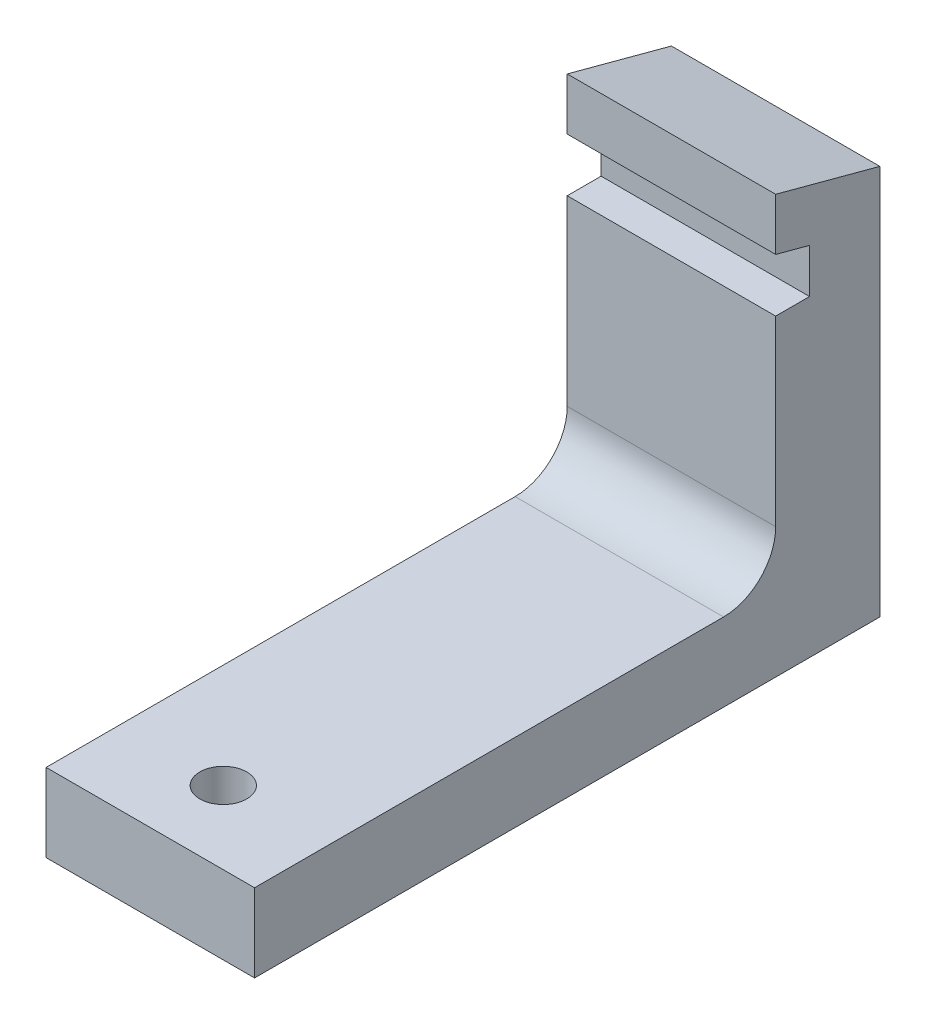
ISO-10303-21;
HEADER;
FILE_DESCRIPTION(('STEP AP214'),'2;1');
FILE_NAME('part.step','',(''),(''),'','','');
FILE_SCHEMA(('AUTOMOTIVE_DESIGN { 1 0 10303 214 1 1 1 1 }'));
ENDSEC;
DATA;
#1=APPLICATION_CONTEXT('core data for automotive mechanical design processes');
#2=APPLICATION_PROTOCOL_DEFINITION('international standard','automotive_design',2000,#1);
#3=PRODUCT_CONTEXT('',#1,'mechanical');
#4=PRODUCT('Part','Part','',(#3));
#5=PRODUCT_RELATED_PRODUCT_CATEGORY('part','',(#4));
#6=PRODUCT_DEFINITION_FORMATION('','',#4);
#7=PRODUCT_DEFINITION_CONTEXT('part definition',#1,'design');
#8=PRODUCT_DEFINITION('design','',#6,#7);
#9=PRODUCT_DEFINITION_SHAPE('','',#8);
#10=(LENGTH_UNIT() NAMED_UNIT(*) SI_UNIT(.MILLI.,.METRE.));
#11=(NAMED_UNIT(*) PLANE_ANGLE_UNIT() SI_UNIT($,.RADIAN.));
#12=(NAMED_UNIT(*) SI_UNIT($,.STERADIAN.) SOLID_ANGLE_UNIT());
#13=UNCERTAINTY_MEASURE_WITH_UNIT(LENGTH_MEASURE(1.E-05),#10,'distance_accuracy_value','');
#14=(GEOMETRIC_REPRESENTATION_CONTEXT(3) GLOBAL_UNCERTAINTY_ASSIGNED_CONTEXT((#13)) GLOBAL_UNIT_ASSIGNED_CONTEXT((#10,
#11,#12)) REPRESENTATION_CONTEXT('',''));
#15=CARTESIAN_POINT('',(0.,0.,0.));
#16=DIRECTION('',(0.,0.,1.));
#17=DIRECTION('',(1.,0.,0.));
#18=AXIS2_PLACEMENT_3D('',#15,#16,#17);
#19=CARTESIAN_POINT('',(4.,3.,0.));
#20=DIRECTION('',(0.,0.,-1.));
#21=DIRECTION('',(0.,1.,0.));
#22=AXIS2_PLACEMENT_3D('',#19,#20,#21);
#23=PLANE('',#22);
#24=DIRECTION('',(0.,-1.,0.));
#25=VECTOR('',#24,1.);
#26=CARTESIAN_POINT('',(-4.,3.,0.));
#27=LINE('',#26,#25);
#28=CARTESIAN_POINT('',(-4.,3.,0.));
#29=VERTEX_POINT('',#28);
#30=CARTESIAN_POINT('',(-4.,0.,0.));
#31=VERTEX_POINT('',#30);
#32=EDGE_CURVE('E143',#29,#31,#27,.T.);
#33=ORIENTED_EDGE('',*,*,#32,.T.);
#34=DIRECTION('',(-1.,0.,0.));
#35=VECTOR('',#34,1.);
#36=CARTESIAN_POINT('',(4.,0.,0.));
#37=LINE('',#36,#35);
#38=CARTESIAN_POINT('',(4.,0.,0.));
#39=VERTEX_POINT('',#38);
#40=EDGE_CURVE('E124',#39,#31,#37,.T.);
#41=ORIENTED_EDGE('',*,*,#40,.F.);
#42=DIRECTION('',(0.,-1.,0.));
#43=VECTOR('',#42,1.);
#44=CARTESIAN_POINT('',(4.,3.,0.));
#45=LINE('',#44,#43);
#46=CARTESIAN_POINT('',(4.,3.,0.));
#47=VERTEX_POINT('',#46);
#48=EDGE_CURVE('E131',#47,#39,#45,.T.);
#49=ORIENTED_EDGE('',*,*,#48,.F.);
#50=DIRECTION('',(-1.,0.,0.));
#51=VECTOR('',#50,1.);
#52=CARTESIAN_POINT('',(4.,3.,0.));
#53=LINE('',#52,#51);
#54=EDGE_CURVE('E170',#47,#29,#53,.T.);
#55=ORIENTED_EDGE('',*,*,#54,.T.);
#56=EDGE_LOOP('',(#33,#41,#49,#55));
#57=FACE_BOUND('',#56,.T.);
#58=ADVANCED_FACE('F36',(#57),#23,.F.);
#59=CARTESIAN_POINT('',(4.,0.,0.));
#60=DIRECTION('',(0.,1.,0.));
#61=DIRECTION('',(0.,0.,1.));
#62=AXIS2_PLACEMENT_3D('',#59,#60,#61);
#63=PLANE('',#62);
#64=CARTESIAN_POINT('',(0.,0.,-20.8));
#65=DIRECTION('',(0.,-1.,0.));
#66=DIRECTION('',(0.,0.,-1.));
#67=AXIS2_PLACEMENT_3D('',#64,#65,#66);
#68=CIRCLE('',#67,0.9);
#69=CARTESIAN_POINT('',(0.,0.,-21.7));
#70=VERTEX_POINT('',#69);
#71=EDGE_CURVE('E207',#70,#70,#68,.T.);
#72=ORIENTED_EDGE('',*,*,#71,.F.);
#73=EDGE_LOOP('',(#72));
#74=FACE_BOUND('',#73,.T.);
#75=CARTESIAN_POINT('',(0.,0.,-2.8));
#76=DIRECTION('',(0.,-1.,0.));
#77=DIRECTION('',(0.,0.,-1.));
#78=AXIS2_PLACEMENT_3D('',#75,#76,#77);
#79=CIRCLE('',#78,0.9);
#80=CARTESIAN_POINT('',(0.,0.,-3.7));
#81=VERTEX_POINT('',#80);
#82=EDGE_CURVE('E204',#81,#81,#79,.T.);
#83=ORIENTED_EDGE('',*,*,#82,.F.);
#84=EDGE_LOOP('',(#83));
#85=FACE_BOUND('',#84,.T.);
#86=DIRECTION('',(0.,0.,-1.));
#87=VECTOR('',#86,1.);
#88=CARTESIAN_POINT('',(-4.,0.,0.));
#89=LINE('',#88,#87);
#90=CARTESIAN_POINT('',(-4.,0.,-24.));
#91=VERTEX_POINT('',#90);
#92=EDGE_CURVE('E187',#31,#91,#89,.T.);
#93=ORIENTED_EDGE('',*,*,#92,.T.);
#94=DIRECTION('',(-1.,0.,0.));
#95=VECTOR('',#94,1.);
#96=CARTESIAN_POINT('',(4.,0.,-24.));
#97=LINE('',#96,#95);
#98=CARTESIAN_POINT('',(4.,0.,-24.));
#99=VERTEX_POINT('',#98);
#100=EDGE_CURVE('E127',#99,#91,#97,.T.);
#101=ORIENTED_EDGE('',*,*,#100,.F.);
#102=DIRECTION('',(0.,0.,-1.));
#103=VECTOR('',#102,1.);
#104=CARTESIAN_POINT('',(4.,0.,0.));
#105=LINE('',#104,#103);
#106=EDGE_CURVE('E120',#39,#99,#105,.T.);
#107=ORIENTED_EDGE('',*,*,#106,.F.);
#108=ORIENTED_EDGE('',*,*,#40,.T.);
#109=EDGE_LOOP('',(#93,#101,#107,#108));
#110=FACE_BOUND('',#109,.T.);
#111=ADVANCED_FACE('F122',(#74,#85,#110),#63,.F.);
#112=CARTESIAN_POINT('',(4.,0.,-24.));
#113=DIRECTION('',(0.,0.,1.));
#114=DIRECTION('',(1.,0.,0.));
#115=AXIS2_PLACEMENT_3D('',#112,#113,#114);
#116=PLANE('',#115);
#117=DIRECTION('',(0.,1.,0.));
#118=VECTOR('',#117,1.);
#119=CARTESIAN_POINT('',(-4.,0.,-24.));
#120=LINE('',#119,#118);
#121=CARTESIAN_POINT('',(-4.,14.976537180436,-24.));
#122=VERTEX_POINT('',#121);
#123=EDGE_CURVE('E185',#91,#122,#120,.T.);
#124=ORIENTED_EDGE('',*,*,#123,.T.);
#125=DIRECTION('',(-1.,0.,0.));
#126=VECTOR('',#125,1.);
#127=CARTESIAN_POINT('',(4.,14.976537180436,-24.));
#128=LINE('',#127,#126);
#129=CARTESIAN_POINT('',(4.,14.976537180436,-24.));
#130=VERTEX_POINT('',#129);
#131=EDGE_CURVE('E148',#130,#122,#128,.T.);
#132=ORIENTED_EDGE('',*,*,#131,.F.);
#133=DIRECTION('',(0.,1.,0.));
#134=VECTOR('',#133,1.);
#135=CARTESIAN_POINT('',(4.,0.,-24.));
#136=LINE('',#135,#134);
#137=EDGE_CURVE('E130',#99,#130,#136,.T.);
#138=ORIENTED_EDGE('',*,*,#137,.F.);
#139=ORIENTED_EDGE('',*,*,#100,.T.);
#140=EDGE_LOOP('',(#124,#132,#138,#139));
#141=FACE_BOUND('',#140,.T.);
#142=ADVANCED_FACE('F239',(#141),#116,.F.);
#143=CARTESIAN_POINT('',(4.,16.0483339501605,-20.));
#144=DIRECTION('',(0.,-0.965925826289068,0.25881904510252));
#145=DIRECTION('',(0.,-0.25881904510252,-0.965925826289068));
#146=AXIS2_PLACEMENT_3D('',#143,#144,#145);
#147=PLANE('',#146);
#148=DIRECTION('',(0.,0.25881904510252,0.965925826289069));
#149=VECTOR('',#148,1.);
#150=CARTESIAN_POINT('',(-4.,16.0483339501605,-20.));
#151=LINE('',#150,#149);
#152=CARTESIAN_POINT('',(-4.,16.0483339501605,-20.));
#153=VERTEX_POINT('',#152);
#154=EDGE_CURVE('E183',#122,#153,#151,.T.);
#155=ORIENTED_EDGE('',*,*,#154,.T.);
#156=DIRECTION('',(-1.,0.,0.));
#157=VECTOR('',#156,1.);
#158=CARTESIAN_POINT('',(4.,16.0483339501605,-20.));
#159=LINE('',#158,#157);
#160=CARTESIAN_POINT('',(4.,16.0483339501605,-20.));
#161=VERTEX_POINT('',#160);
#162=EDGE_CURVE('E155',#161,#153,#159,.T.);
#163=ORIENTED_EDGE('',*,*,#162,.F.);
#164=DIRECTION('',(0.,0.25881904510252,0.965925826289069));
#165=VECTOR('',#164,1.);
#166=CARTESIAN_POINT('',(4.,16.0483339501605,-20.));
#167=LINE('',#166,#165);
#168=EDGE_CURVE('E201',#130,#161,#167,.T.);
#169=ORIENTED_EDGE('',*,*,#168,.F.);
#170=ORIENTED_EDGE('',*,*,#131,.T.);
#171=EDGE_LOOP('',(#155,#163,#169,#170));
#172=FACE_BOUND('',#171,.T.);
#173=ADVANCED_FACE('F245',(#172),#147,.F.);
#174=CARTESIAN_POINT('',(4.,14.0483339501605,-20.));
#175=DIRECTION('',(0.,0.,-1.));
#176=DIRECTION('',(-1.,0.,0.));
#177=AXIS2_PLACEMENT_3D('',#174,#175,#176);
#178=PLANE('',#177);
#179=DIRECTION('',(0.,-1.,0.));
#180=VECTOR('',#179,1.);
#181=CARTESIAN_POINT('',(-4.,14.0483339501605,-20.));
#182=LINE('',#181,#180);
#183=CARTESIAN_POINT('',(-4.,14.0483339501605,-20.));
#184=VERTEX_POINT('',#183);
#185=EDGE_CURVE('E181',#153,#184,#182,.T.);
#186=ORIENTED_EDGE('',*,*,#185,.T.);
#187=DIRECTION('',(-1.,0.,0.));
#188=VECTOR('',#187,1.);
#189=CARTESIAN_POINT('',(4.,14.0483339501605,-20.));
#190=LINE('',#189,#188);
#191=CARTESIAN_POINT('',(4.,14.0483339501605,-20.));
#192=VERTEX_POINT('',#191);
#193=EDGE_CURVE('E158',#192,#184,#190,.T.);
#194=ORIENTED_EDGE('',*,*,#193,.F.);
#195=DIRECTION('',(0.,-1.,0.));
#196=VECTOR('',#195,1.);
#197=CARTESIAN_POINT('',(4.,14.0483339501605,-20.));
#198=LINE('',#197,#196);
#199=EDGE_CURVE('E199',#161,#192,#198,.T.);
#200=ORIENTED_EDGE('',*,*,#199,.F.);
#201=ORIENTED_EDGE('',*,*,#162,.T.);
#202=EDGE_LOOP('',(#186,#194,#200,#201));
#203=FACE_BOUND('',#202,.T.);
#204=ADVANCED_FACE('F249',(#203),#178,.F.);
#205=CARTESIAN_POINT('',(4.,13.7,-21.3));
#206=DIRECTION('',(0.,0.965925826289068,-0.258819045102522));
#207=DIRECTION('',(0.,0.258819045102522,0.965925826289068));
#208=AXIS2_PLACEMENT_3D('',#205,#206,#207);
#209=PLANE('',#208);
#210=DIRECTION('',(0.,-0.258819045102522,-0.965925826289068));
#211=VECTOR('',#210,1.);
#212=CARTESIAN_POINT('',(-4.,13.7,-21.3));
#213=LINE('',#212,#211);
#214=CARTESIAN_POINT('',(-4.,13.7,-21.3));
#215=VERTEX_POINT('',#214);
#216=EDGE_CURVE('E179',#184,#215,#213,.T.);
#217=ORIENTED_EDGE('',*,*,#216,.T.);
#218=DIRECTION('',(-1.,0.,0.));
#219=VECTOR('',#218,1.);
#220=CARTESIAN_POINT('',(4.,13.7,-21.3));
#221=LINE('',#220,#219);
#222=CARTESIAN_POINT('',(4.,13.7,-21.3));
#223=VERTEX_POINT('',#222);
#224=EDGE_CURVE('E161',#223,#215,#221,.T.);
#225=ORIENTED_EDGE('',*,*,#224,.F.);
#226=DIRECTION('',(0.,-0.258819045102522,-0.965925826289068));
#227=VECTOR('',#226,1.);
#228=CARTESIAN_POINT('',(4.,13.7,-21.3));
#229=LINE('',#228,#227);
#230=EDGE_CURVE('E197',#192,#223,#229,.T.);
#231=ORIENTED_EDGE('',*,*,#230,.F.);
#232=ORIENTED_EDGE('',*,*,#193,.T.);
#233=EDGE_LOOP('',(#217,#225,#231,#232));
#234=FACE_BOUND('',#233,.T.);
#235=ADVANCED_FACE('F253',(#234),#209,.F.);
#236=CARTESIAN_POINT('',(4.,12.,-21.3));
#237=DIRECTION('',(0.,0.,-1.));
#238=DIRECTION('',(0.,1.,0.));
#239=AXIS2_PLACEMENT_3D('',#236,#237,#238);
#240=PLANE('',#239);
#241=DIRECTION('',(0.,-1.,0.));
#242=VECTOR('',#241,1.);
#243=CARTESIAN_POINT('',(-4.,12.,-21.3));
#244=LINE('',#243,#242);
#245=CARTESIAN_POINT('',(-4.,12.,-21.3));
#246=VERTEX_POINT('',#245);
#247=EDGE_CURVE('E177',#215,#246,#244,.T.);
#248=ORIENTED_EDGE('',*,*,#247,.T.);
#249=DIRECTION('',(-1.,0.,0.));
#250=VECTOR('',#249,1.);
#251=CARTESIAN_POINT('',(4.,12.,-21.3));
#252=LINE('',#251,#250);
#253=CARTESIAN_POINT('',(4.,12.,-21.3));
#254=VERTEX_POINT('',#253);
#255=EDGE_CURVE('E164',#254,#246,#252,.T.);
#256=ORIENTED_EDGE('',*,*,#255,.F.);
#257=DIRECTION('',(0.,-1.,0.));
#258=VECTOR('',#257,1.);
#259=CARTESIAN_POINT('',(4.,12.,-21.3));
#260=LINE('',#259,#258);
#261=EDGE_CURVE('E195',#223,#254,#260,.T.);
#262=ORIENTED_EDGE('',*,*,#261,.F.);
#263=ORIENTED_EDGE('',*,*,#224,.T.);
#264=EDGE_LOOP('',(#248,#256,#262,#263));
#265=FACE_BOUND('',#264,.T.);
#266=ADVANCED_FACE('F257',(#265),#240,.F.);
#267=CARTESIAN_POINT('',(4.,12.,-20.));
#268=DIRECTION('',(0.,-1.,0.));
#269=DIRECTION('',(0.,0.,-1.));
#270=AXIS2_PLACEMENT_3D('',#267,#268,#269);
#271=PLANE('',#270);
#272=DIRECTION('',(0.,0.,1.));
#273=VECTOR('',#272,1.);
#274=CARTESIAN_POINT('',(-4.,12.,-20.));
#275=LINE('',#274,#273);
#276=CARTESIAN_POINT('',(-4.,12.,-20.));
#277=VERTEX_POINT('',#276);
#278=EDGE_CURVE('E175',#246,#277,#275,.T.);
#279=ORIENTED_EDGE('',*,*,#278,.T.);
#280=DIRECTION('',(-1.,0.,0.));
#281=VECTOR('',#280,1.);
#282=CARTESIAN_POINT('',(4.,12.,-20.));
#283=LINE('',#282,#281);
#284=CARTESIAN_POINT('',(4.,12.,-20.));
#285=VERTEX_POINT('',#284);
#286=EDGE_CURVE('E167',#285,#277,#283,.T.);
#287=ORIENTED_EDGE('',*,*,#286,.F.);
#288=DIRECTION('',(0.,0.,1.));
#289=VECTOR('',#288,1.);
#290=CARTESIAN_POINT('',(4.,12.,-20.));
#291=LINE('',#290,#289);
#292=EDGE_CURVE('E193',#254,#285,#291,.T.);
#293=ORIENTED_EDGE('',*,*,#292,.F.);
#294=ORIENTED_EDGE('',*,*,#255,.T.);
#295=EDGE_LOOP('',(#279,#287,#293,#294));
#296=FACE_BOUND('',#295,.T.);
#297=ADVANCED_FACE('F261',(#296),#271,.F.);
#298=CARTESIAN_POINT('',(4.,3.,-20.));
#299=DIRECTION('',(0.,0.,-1.));
#300=DIRECTION('',(-1.,0.,0.));
#301=AXIS2_PLACEMENT_3D('',#298,#299,#300);
#302=PLANE('',#301);
#303=DIRECTION('',(0.,-1.,0.));
#304=VECTOR('',#303,1.);
#305=CARTESIAN_POINT('',(-4.,3.,-20.));
#306=LINE('',#305,#304);
#307=CARTESIAN_POINT('',(-4.,5.,-20.));
#308=VERTEX_POINT('',#307);
#309=EDGE_CURVE('E173',#277,#308,#306,.T.);
#310=ORIENTED_EDGE('',*,*,#309,.T.);
#311=DIRECTION('',(-1.,0.,0.));
#312=VECTOR('',#311,1.);
#313=CARTESIAN_POINT('',(4.,5.,-20.));
#314=LINE('',#313,#312);
#315=CARTESIAN_POINT('',(4.,5.,-20.));
#316=VERTEX_POINT('',#315);
#317=EDGE_CURVE('E52',#308,#316,#314,.F.);
#318=ORIENTED_EDGE('',*,*,#317,.T.);
#319=DIRECTION('',(0.,-1.,0.));
#320=VECTOR('',#319,1.);
#321=CARTESIAN_POINT('',(4.,3.,-20.));
#322=LINE('',#321,#320);
#323=EDGE_CURVE('E191',#285,#316,#322,.T.);
#324=ORIENTED_EDGE('',*,*,#323,.F.);
#325=ORIENTED_EDGE('',*,*,#286,.T.);
#326=EDGE_LOOP('',(#310,#318,#324,#325));
#327=FACE_BOUND('',#326,.T.);
#328=ADVANCED_FACE('F265',(#327),#302,.F.);
#329=CARTESIAN_POINT('',(4.,3.,0.));
#330=DIRECTION('',(0.,-1.,0.));
#331=DIRECTION('',(0.,0.,-1.));
#332=AXIS2_PLACEMENT_3D('',#329,#330,#331);
#333=PLANE('',#332);
#334=CARTESIAN_POINT('',(0.,3.,-2.8));
#335=DIRECTION('',(0.,-1.,0.));
#336=DIRECTION('',(0.,0.,-1.));
#337=AXIS2_PLACEMENT_3D('',#334,#335,#336);
#338=CIRCLE('',#337,0.9);
#339=CARTESIAN_POINT('',(0.,3.,-3.7));
#340=VERTEX_POINT('',#339);
#341=EDGE_CURVE('E40',#340,#340,#338,.T.);
#342=ORIENTED_EDGE('',*,*,#341,.T.);
#343=EDGE_LOOP('',(#342));
#344=FACE_BOUND('',#343,.T.);
#345=DIRECTION('',(0.,0.,1.));
#346=VECTOR('',#345,1.);
#347=CARTESIAN_POINT('',(4.,3.,0.));
#348=LINE('',#347,#346);
#349=CARTESIAN_POINT('',(4.,3.,-18.));
#350=VERTEX_POINT('',#349);
#351=EDGE_CURVE('E136',#350,#47,#348,.T.);
#352=ORIENTED_EDGE('',*,*,#351,.F.);
#353=DIRECTION('',(-1.,0.,0.));
#354=VECTOR('',#353,1.);
#355=CARTESIAN_POINT('',(-4.,3.,-18.));
#356=LINE('',#355,#354);
#357=CARTESIAN_POINT('',(-4.,3.,-18.));
#358=VERTEX_POINT('',#357);
#359=EDGE_CURVE('E144',#350,#358,#356,.T.);
#360=ORIENTED_EDGE('',*,*,#359,.T.);
#361=DIRECTION('',(0.,0.,1.));
#362=VECTOR('',#361,1.);
#363=CARTESIAN_POINT('',(-4.,3.,0.));
#364=LINE('',#363,#362);
#365=EDGE_CURVE('E140',#358,#29,#364,.T.);
#366=ORIENTED_EDGE('',*,*,#365,.T.);
#367=ORIENTED_EDGE('',*,*,#54,.F.);
#368=EDGE_LOOP('',(#352,#360,#366,#367));
#369=FACE_BOUND('',#368,.T.);
#370=ADVANCED_FACE('F217',(#344,#369),#333,.F.);
#371=CARTESIAN_POINT('',(4.,0.,0.));
#372=DIRECTION('',(1.,0.,0.));
#373=DIRECTION('',(0.,0.,-1.));
#374=AXIS2_PLACEMENT_3D('',#371,#372,#373);
#375=PLANE('',#374);
#376=ORIENTED_EDGE('',*,*,#48,.T.);
#377=ORIENTED_EDGE('',*,*,#106,.T.);
#378=ORIENTED_EDGE('',*,*,#137,.T.);
#379=ORIENTED_EDGE('',*,*,#168,.T.);
#380=ORIENTED_EDGE('',*,*,#199,.T.);
#381=ORIENTED_EDGE('',*,*,#230,.T.);
#382=ORIENTED_EDGE('',*,*,#261,.T.);
#383=ORIENTED_EDGE('',*,*,#292,.T.);
#384=ORIENTED_EDGE('',*,*,#323,.T.);
#385=CARTESIAN_POINT('',(4.,5.,-18.));
#386=DIRECTION('',(1.,0.,0.));
#387=DIRECTION('',(0.,0.,-1.));
#388=AXIS2_PLACEMENT_3D('',#385,#386,#387);
#389=CIRCLE('',#388,2.);
#390=EDGE_CURVE('E11',#316,#350,#389,.F.);
#391=ORIENTED_EDGE('',*,*,#390,.T.);
#392=ORIENTED_EDGE('',*,*,#351,.T.);
#393=EDGE_LOOP('',(#376,#377,#378,#379,#380,#381,#382,#383,#384,#391,#392));
#394=FACE_BOUND('',#393,.T.);
#395=ADVANCED_FACE('F134',(#394),#375,.T.);
#396=CARTESIAN_POINT('',(-4.,0.,0.));
#397=DIRECTION('',(1.,0.,0.));
#398=DIRECTION('',(0.,0.,-1.));
#399=AXIS2_PLACEMENT_3D('',#396,#397,#398);
#400=PLANE('',#399);
#401=ORIENTED_EDGE('',*,*,#32,.F.);
#402=ORIENTED_EDGE('',*,*,#365,.F.);
#403=CARTESIAN_POINT('',(-4.,5.,-18.));
#404=DIRECTION('',(1.,0.,0.));
#405=DIRECTION('',(0.,0.,-1.));
#406=AXIS2_PLACEMENT_3D('',#403,#404,#405);
#407=CIRCLE('',#406,2.);
#408=EDGE_CURVE('E45',#358,#308,#407,.T.);
#409=ORIENTED_EDGE('',*,*,#408,.T.);
#410=ORIENTED_EDGE('',*,*,#309,.F.);
#411=ORIENTED_EDGE('',*,*,#278,.F.);
#412=ORIENTED_EDGE('',*,*,#247,.F.);
#413=ORIENTED_EDGE('',*,*,#216,.F.);
#414=ORIENTED_EDGE('',*,*,#185,.F.);
#415=ORIENTED_EDGE('',*,*,#154,.F.);
#416=ORIENTED_EDGE('',*,*,#123,.F.);
#417=ORIENTED_EDGE('',*,*,#92,.F.);
#418=EDGE_LOOP('',(#401,#402,#409,#410,#411,#412,#413,#414,#415,#416,#417));
#419=FACE_BOUND('',#418,.T.);
#420=ADVANCED_FACE('F232',(#419),#400,.F.);
#421=CARTESIAN_POINT('',(4.,5.,-18.));
#422=DIRECTION('',(1.,0.,0.));
#423=DIRECTION('',(0.,0.,-1.));
#424=AXIS2_PLACEMENT_3D('',#421,#422,#423);
#425=CYLINDRICAL_SURFACE('',#424,2.);
#426=ORIENTED_EDGE('',*,*,#390,.F.);
#427=ORIENTED_EDGE('',*,*,#317,.F.);
#428=ORIENTED_EDGE('',*,*,#408,.F.);
#429=ORIENTED_EDGE('',*,*,#359,.F.);
#430=EDGE_LOOP('',(#426,#427,#428,#429));
#431=FACE_BOUND('',#430,.T.);
#432=ADVANCED_FACE('F38',(#431),#425,.F.);
#433=CARTESIAN_POINT('',(0.,4.,-2.8));
#434=DIRECTION('',(0.,-1.,0.));
#435=DIRECTION('',(0.,0.,-1.));
#436=AXIS2_PLACEMENT_3D('',#433,#434,#435);
#437=CYLINDRICAL_SURFACE('',#436,0.9);
#438=ORIENTED_EDGE('',*,*,#82,.T.);
#439=EDGE_LOOP('',(#438));
#440=FACE_BOUND('',#439,.T.);
#441=ORIENTED_EDGE('',*,*,#341,.F.);
#442=EDGE_LOOP('',(#441));
#443=FACE_BOUND('',#442,.T.);
#444=ADVANCED_FACE('F220',(#440,#443),#437,.F.);
#445=CARTESIAN_POINT('',(0.,4.,-20.8));
#446=DIRECTION('',(0.,-1.,0.));
#447=DIRECTION('',(0.,0.,-1.));
#448=AXIS2_PLACEMENT_3D('',#445,#446,#447);
#449=CYLINDRICAL_SURFACE('',#448,0.9);
#450=CARTESIAN_POINT('',(0.,4.,-20.8));
#451=DIRECTION('',(0.,-1.,0.));
#452=DIRECTION('',(0.,0.,-1.));
#453=AXIS2_PLACEMENT_3D('',#450,#451,#452);
#454=CIRCLE('',#453,0.9);
#455=CARTESIAN_POINT('',(0.,4.,-21.7));
#456=VERTEX_POINT('',#455);
#457=EDGE_CURVE('E210',#456,#456,#454,.T.);
#458=ORIENTED_EDGE('',*,*,#457,.F.);
#459=EDGE_LOOP('',(#458));
#460=FACE_BOUND('',#459,.T.);
#461=ORIENTED_EDGE('',*,*,#71,.T.);
#462=EDGE_LOOP('',(#461));
#463=FACE_BOUND('',#462,.T.);
#464=ADVANCED_FACE('F222',(#460,#463),#449,.F.);
#465=CARTESIAN_POINT('',(0.,4.,-20.8));
#466=DIRECTION('',(0.,-1.,0.));
#467=DIRECTION('',(0.,0.,-1.));
#468=AXIS2_PLACEMENT_3D('',#465,#466,#467);
#469=PLANE('',#468);
#470=ORIENTED_EDGE('',*,*,#457,.T.);
#471=EDGE_LOOP('',(#470));
#472=FACE_BOUND('',#471,.T.);
#473=ADVANCED_FACE('F229',(#472),#469,.T.);
#474=CLOSED_SHELL('',(#58,#111,#142,#173,#204,#235,#266,#297,#328,#370,#395,#420,#432,#444,#464,#473));
#475=MANIFOLD_SOLID_BREP('B2',#474);
#476=ADVANCED_BREP_SHAPE_REPRESENTATION('',(#18,#475),#14);
#477=SHAPE_DEFINITION_REPRESENTATION(#9,#476);
ENDSEC;
END-ISO-10303-21;
